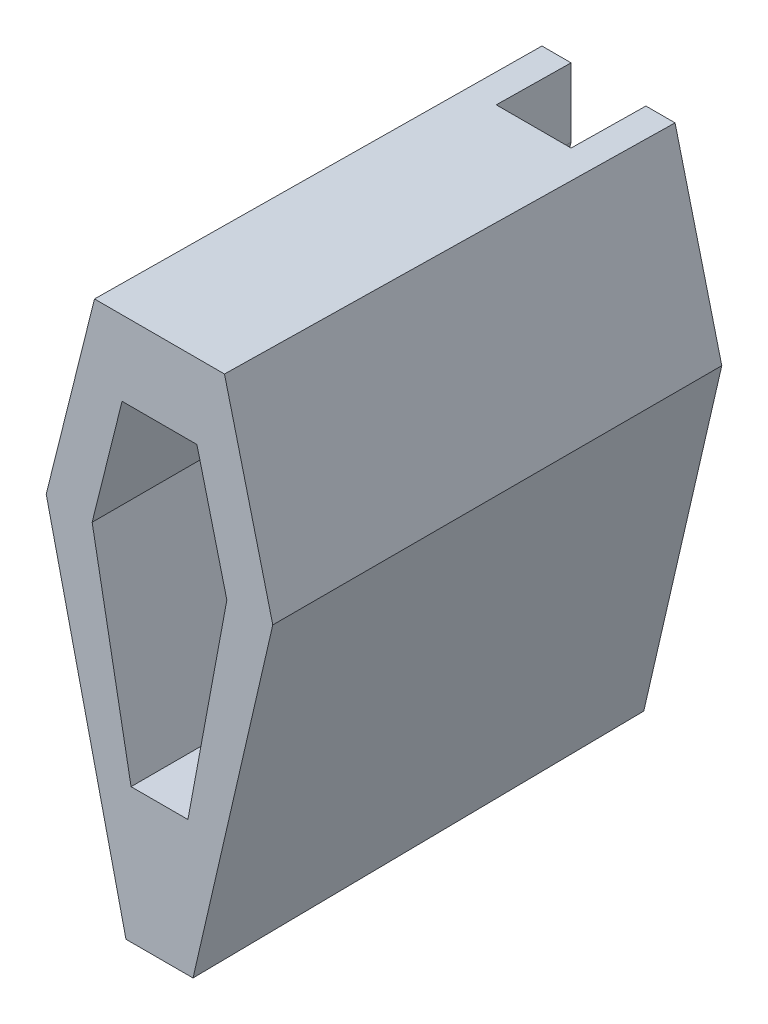
ISO-10303-21;
HEADER;
FILE_DESCRIPTION(('STEP AP214'),'2;1');
FILE_NAME('part.step','',(''),(''),'','','');
FILE_SCHEMA(('AUTOMOTIVE_DESIGN { 1 0 10303 214 1 1 1 1 }'));
ENDSEC;
DATA;
#1=APPLICATION_CONTEXT('core data for automotive mechanical design processes');
#2=APPLICATION_PROTOCOL_DEFINITION('international standard','automotive_design',2000,#1);
#3=PRODUCT_CONTEXT('',#1,'mechanical');
#4=PRODUCT('Part','Part','',(#3));
#5=PRODUCT_RELATED_PRODUCT_CATEGORY('part','',(#4));
#6=PRODUCT_DEFINITION_FORMATION('','',#4);
#7=PRODUCT_DEFINITION_CONTEXT('part definition',#1,'design');
#8=PRODUCT_DEFINITION('design','',#6,#7);
#9=PRODUCT_DEFINITION_SHAPE('','',#8);
#10=(LENGTH_UNIT() NAMED_UNIT(*) SI_UNIT(.MILLI.,.METRE.));
#11=(NAMED_UNIT(*) PLANE_ANGLE_UNIT() SI_UNIT($,.RADIAN.));
#12=(NAMED_UNIT(*) SI_UNIT($,.STERADIAN.) SOLID_ANGLE_UNIT());
#13=UNCERTAINTY_MEASURE_WITH_UNIT(LENGTH_MEASURE(1.E-05),#10,'distance_accuracy_value','');
#14=(GEOMETRIC_REPRESENTATION_CONTEXT(3) GLOBAL_UNCERTAINTY_ASSIGNED_CONTEXT((#13)) GLOBAL_UNIT_ASSIGNED_CONTEXT((#10,
#11,#12)) REPRESENTATION_CONTEXT('',''));
#15=CARTESIAN_POINT('',(0.,0.,0.));
#16=DIRECTION('',(0.,0.,1.));
#17=DIRECTION('',(1.,0.,0.));
#18=AXIS2_PLACEMENT_3D('',#15,#16,#17);
#19=CARTESIAN_POINT('',(2.5,6.80601654550013,30.0001));
#20=DIRECTION('',(0.,-1.,0.));
#21=DIRECTION('',(0.,0.,-1.));
#22=AXIS2_PLACEMENT_3D('',#19,#20,#21);
#23=PLANE('',#22);
#24=DIRECTION('',(0.,0.,-1.));
#25=VECTOR('',#24,1.);
#26=CARTESIAN_POINT('',(-2.5,6.80601654550013,30.0001));
#27=LINE('',#26,#25);
#28=CARTESIAN_POINT('',(-2.5,6.80601654550013,30.));
#29=VERTEX_POINT('',#28);
#30=CARTESIAN_POINT('',(-2.5,6.80601654550013,5.));
#31=VERTEX_POINT('',#30);
#32=EDGE_CURVE('E182',#29,#31,#27,.T.);
#33=ORIENTED_EDGE('',*,*,#32,.T.);
#34=DIRECTION('',(-1.,0.,0.));
#35=VECTOR('',#34,1.);
#36=CARTESIAN_POINT('',(2.5,6.80601654550013,5.));
#37=LINE('',#36,#35);
#38=CARTESIAN_POINT('',(2.5,6.80601654550013,5.));
#39=VERTEX_POINT('',#38);
#40=EDGE_CURVE('E168',#39,#31,#37,.T.);
#41=ORIENTED_EDGE('',*,*,#40,.F.);
#42=DIRECTION('',(0.,0.,-1.));
#43=VECTOR('',#42,1.);
#44=CARTESIAN_POINT('',(2.5,6.80601654550013,30.0001));
#45=LINE('',#44,#43);
#46=CARTESIAN_POINT('',(2.5,6.80601654550013,30.));
#47=VERTEX_POINT('',#46);
#48=EDGE_CURVE('E483',#47,#39,#45,.T.);
#49=ORIENTED_EDGE('',*,*,#48,.F.);
#50=DIRECTION('',(-1.,0.,0.));
#51=VECTOR('',#50,1.);
#52=CARTESIAN_POINT('',(0.,6.80601654550013,30.));
#53=LINE('',#52,#51);
#54=EDGE_CURVE('E189',#47,#29,#53,.T.);
#55=ORIENTED_EDGE('',*,*,#54,.T.);
#56=EDGE_LOOP('',(#33,#41,#49,#55));
#57=FACE_BOUND('',#56,.T.);
#58=ADVANCED_FACE('F47',(#57),#23,.T.);
#59=CARTESIAN_POINT('',(0.,0.,30.));
#60=DIRECTION('',(0.,0.,-1.));
#61=DIRECTION('',(-1.,0.,0.));
#62=AXIS2_PLACEMENT_3D('',#59,#60,#61);
#63=PLANE('',#62);
#64=DIRECTION('',(-0.242535625036333,0.970142500145332,0.));
#65=VECTOR('',#64,1.);
#66=CARTESIAN_POINT('',(4.34232921921325,11.8060165455001,30.));
#67=LINE('',#66,#65);
#68=CARTESIAN_POINT('',(7.56878565192639,-1.09980918535245,30.));
#69=VERTEX_POINT('',#68);
#70=CARTESIAN_POINT('',(4.34232921921325,11.8060165455001,30.));
#71=VERTEX_POINT('',#70);
#72=EDGE_CURVE('E297',#69,#71,#67,.T.);
#73=ORIENTED_EDGE('',*,*,#72,.T.);
#74=DIRECTION('',(-1.,0.,0.));
#75=VECTOR('',#74,1.);
#76=CARTESIAN_POINT('',(-4.34232921921325,11.8060165455001,30.));
#77=LINE('',#76,#75);
#78=CARTESIAN_POINT('',(-4.34232921921325,11.8060165455001,30.));
#79=VERTEX_POINT('',#78);
#80=EDGE_CURVE('E12',#71,#79,#77,.T.);
#81=ORIENTED_EDGE('',*,*,#80,.T.);
#82=DIRECTION('',(-0.242535625036333,-0.970142500145332,0.));
#83=VECTOR('',#82,1.);
#84=CARTESIAN_POINT('',(-4.34232921921325,11.8060165455001,30.));
#85=LINE('',#84,#83);
#86=CARTESIAN_POINT('',(-7.56878565192639,-1.09980918535245,30.));
#87=VERTEX_POINT('',#86);
#88=EDGE_CURVE('E58',#79,#87,#85,.T.);
#89=ORIENTED_EDGE('',*,*,#88,.T.);
#90=DIRECTION('',(0.224823451265255,-0.974399515476675,0.));
#91=VECTOR('',#90,1.);
#92=CARTESIAN_POINT('',(-7.56878565192639,-1.09980918535245,30.));
#93=LINE('',#92,#91);
#94=CARTESIAN_POINT('',(-2.24026087246672,-24.1939834544998,30.));
#95=VERTEX_POINT('',#94);
#96=EDGE_CURVE('E458',#87,#95,#93,.T.);
#97=ORIENTED_EDGE('',*,*,#96,.T.);
#98=DIRECTION('',(1.,0.,0.));
#99=VECTOR('',#98,1.);
#100=CARTESIAN_POINT('',(2.24026087246701,-24.1939834544998,30.));
#101=LINE('',#100,#99);
#102=CARTESIAN_POINT('',(2.24026087246701,-24.1939834544998,30.));
#103=VERTEX_POINT('',#102);
#104=EDGE_CURVE('E255',#95,#103,#101,.T.);
#105=ORIENTED_EDGE('',*,*,#104,.T.);
#106=DIRECTION('',(0.224823451265243,0.974399515476678,0.));
#107=VECTOR('',#106,1.);
#108=CARTESIAN_POINT('',(7.56878565192639,-1.09980918535245,30.));
#109=LINE('',#108,#107);
#110=EDGE_CURVE('E269',#103,#69,#109,.T.);
#111=ORIENTED_EDGE('',*,*,#110,.T.);
#112=EDGE_LOOP('',(#73,#81,#89,#97,#105,#111));
#113=FACE_BOUND('',#112,.T.);
#114=ORIENTED_EDGE('',*,*,#54,.F.);
#115=DIRECTION('',(0.242535625036333,-0.970142500145332,0.));
#116=VECTOR('',#115,1.);
#117=CARTESIAN_POINT('',(3.95435683423532,0.988589208558831,30.));
#118=LINE('',#117,#116);
#119=CARTESIAN_POINT('',(4.5,-1.19398345449987,30.));
#120=VERTEX_POINT('',#119);
#121=EDGE_CURVE('E190',#47,#120,#118,.T.);
#122=ORIENTED_EDGE('',*,*,#121,.T.);
#123=DIRECTION('',(-0.182592193842777,-0.983188736076488,0.));
#124=VECTOR('',#123,1.);
#125=CARTESIAN_POINT('',(4.56431740848193,-0.847658947289501,30.));
#126=LINE('',#125,#124);
#127=CARTESIAN_POINT('',(1.9,-15.1939834544999,30.));
#128=VERTEX_POINT('',#127);
#129=EDGE_CURVE('E194',#120,#128,#126,.T.);
#130=ORIENTED_EDGE('',*,*,#129,.T.);
#131=DIRECTION('',(1.,0.,0.));
#132=VECTOR('',#131,1.);
#133=CARTESIAN_POINT('',(0.,-15.1939834544999,30.));
#134=LINE('',#133,#132);
#135=CARTESIAN_POINT('',(-1.9,-15.1939834544999,30.));
#136=VERTEX_POINT('',#135);
#137=EDGE_CURVE('E202',#136,#128,#134,.T.);
#138=ORIENTED_EDGE('',*,*,#137,.F.);
#139=DIRECTION('',(0.182592193842777,-0.983188736076488,0.));
#140=VECTOR('',#139,1.);
#141=CARTESIAN_POINT('',(-4.56431740848193,-0.847658947289501,30.));
#142=LINE('',#141,#140);
#143=CARTESIAN_POINT('',(-4.5,-1.19398345449987,30.));
#144=VERTEX_POINT('',#143);
#145=EDGE_CURVE('E204',#144,#136,#142,.T.);
#146=ORIENTED_EDGE('',*,*,#145,.F.);
#147=DIRECTION('',(-0.242535625036333,-0.970142500145332,0.));
#148=VECTOR('',#147,1.);
#149=CARTESIAN_POINT('',(-3.95435683423532,0.988589208558831,30.));
#150=LINE('',#149,#148);
#151=EDGE_CURVE('E206',#29,#144,#150,.T.);
#152=ORIENTED_EDGE('',*,*,#151,.F.);
#153=EDGE_LOOP('',(#114,#122,#130,#138,#146,#152));
#154=FACE_BOUND('',#153,.T.);
#155=ADVANCED_FACE('F49',(#113,#154),#63,.F.);
#156=CARTESIAN_POINT('',(0.,0.,0.));
#157=DIRECTION('',(0.,0.,-1.));
#158=DIRECTION('',(-1.,0.,0.));
#159=AXIS2_PLACEMENT_3D('',#156,#157,#158);
#160=PLANE('',#159);
#161=DIRECTION('',(0.,-1.,0.));
#162=VECTOR('',#161,1.);
#163=CARTESIAN_POINT('',(2.5,6.80601654550013,0.));
#164=LINE('',#163,#162);
#165=CARTESIAN_POINT('',(2.5,11.389549667597,0.));
#166=VERTEX_POINT('',#165);
#167=CARTESIAN_POINT('',(2.5,6.80601654550013,0.));
#168=VERTEX_POINT('',#167);
#169=EDGE_CURVE('E74',#166,#168,#164,.T.);
#170=ORIENTED_EDGE('',*,*,#169,.F.);
#171=DIRECTION('',(-1.,0.,0.));
#172=VECTOR('',#171,1.);
#173=CARTESIAN_POINT('',(-4.44644593868902,11.389549667597,0.));
#174=LINE('',#173,#172);
#175=CARTESIAN_POINT('',(4.44644593868902,11.389549667597,0.));
#176=VERTEX_POINT('',#175);
#177=EDGE_CURVE('E52',#176,#166,#174,.T.);
#178=ORIENTED_EDGE('',*,*,#177,.F.);
#179=DIRECTION('',(-0.242535625036327,0.970142500145333,0.));
#180=VECTOR('',#179,1.);
#181=CARTESIAN_POINT('',(7.56878565192631,-1.09980918535247,0.));
#182=LINE('',#181,#180);
#183=CARTESIAN_POINT('',(7.56878565192631,-1.09980918535247,0.));
#184=VERTEX_POINT('',#183);
#185=EDGE_CURVE('E305',#184,#176,#182,.T.);
#186=ORIENTED_EDGE('',*,*,#185,.F.);
#187=DIRECTION('',(0.22482345126524,0.974399515476679,0.));
#188=VECTOR('',#187,1.);
#189=CARTESIAN_POINT('',(7.56878565192631,-1.09980918535247,0.));
#190=LINE('',#189,#188);
#191=CARTESIAN_POINT('',(2.35562600129471,-23.6939834544998,0.));
#192=VERTEX_POINT('',#191);
#193=EDGE_CURVE('E402',#192,#184,#190,.T.);
#194=ORIENTED_EDGE('',*,*,#193,.F.);
#195=DIRECTION('',(1.,0.,0.));
#196=VECTOR('',#195,1.);
#197=CARTESIAN_POINT('',(-2.35562600129444,-23.6939834544999,0.));
#198=LINE('',#197,#196);
#199=CARTESIAN_POINT('',(-2.35562600129444,-23.6939834544999,0.));
#200=VERTEX_POINT('',#199);
#201=EDGE_CURVE('E341',#200,#192,#198,.T.);
#202=ORIENTED_EDGE('',*,*,#201,.F.);
#203=DIRECTION('',(0.224823451265253,-0.974399515476676,0.));
#204=VECTOR('',#203,1.);
#205=CARTESIAN_POINT('',(-2.35562600129444,-23.6939834544999,0.));
#206=LINE('',#205,#204);
#207=CARTESIAN_POINT('',(-7.56878565192634,-1.09980918535246,0.));
#208=VERTEX_POINT('',#207);
#209=EDGE_CURVE('E215',#208,#200,#206,.T.);
#210=ORIENTED_EDGE('',*,*,#209,.F.);
#211=DIRECTION('',(-0.242535625036329,-0.970142500145333,0.));
#212=VECTOR('',#211,1.);
#213=CARTESIAN_POINT('',(-7.56878565192634,-1.09980918535246,0.));
#214=LINE('',#213,#212);
#215=CARTESIAN_POINT('',(-4.44644593868902,11.389549667597,0.));
#216=VERTEX_POINT('',#215);
#217=EDGE_CURVE('E209',#216,#208,#214,.T.);
#218=ORIENTED_EDGE('',*,*,#217,.F.);
#219=CARTESIAN_POINT('',(-2.5,11.389549667597,0.));
#220=VERTEX_POINT('',#219);
#221=EDGE_CURVE('E396',#220,#216,#174,.T.);
#222=ORIENTED_EDGE('',*,*,#221,.F.);
#223=DIRECTION('',(0.,1.,0.));
#224=VECTOR('',#223,1.);
#225=CARTESIAN_POINT('',(-2.5,6.80601654550013,0.));
#226=LINE('',#225,#224);
#227=CARTESIAN_POINT('',(-2.5,6.80601654550013,0.));
#228=VERTEX_POINT('',#227);
#229=EDGE_CURVE('E466',#228,#220,#226,.T.);
#230=ORIENTED_EDGE('',*,*,#229,.F.);
#231=DIRECTION('',(-0.242535625036333,-0.970142500145332,0.));
#232=VECTOR('',#231,1.);
#233=CARTESIAN_POINT('',(-2.5,6.80601654550013,0.));
#234=LINE('',#233,#232);
#235=CARTESIAN_POINT('',(-4.5,-1.19398345449987,0.));
#236=VERTEX_POINT('',#235);
#237=EDGE_CURVE('E185',#228,#236,#234,.T.);
#238=ORIENTED_EDGE('',*,*,#237,.T.);
#239=DIRECTION('',(0.182592193842777,-0.983188736076488,0.));
#240=VECTOR('',#239,1.);
#241=CARTESIAN_POINT('',(-4.5,-1.19398345449987,0.));
#242=LINE('',#241,#240);
#243=CARTESIAN_POINT('',(-1.9,-15.1939834544999,0.));
#244=VERTEX_POINT('',#243);
#245=EDGE_CURVE('E472',#236,#244,#242,.T.);
#246=ORIENTED_EDGE('',*,*,#245,.T.);
#247=DIRECTION('',(1.,0.,0.));
#248=VECTOR('',#247,1.);
#249=CARTESIAN_POINT('',(-1.9,-15.1939834544999,0.));
#250=LINE('',#249,#248);
#251=CARTESIAN_POINT('',(1.9,-15.1939834544999,0.));
#252=VERTEX_POINT('',#251);
#253=EDGE_CURVE('E475',#244,#252,#250,.T.);
#254=ORIENTED_EDGE('',*,*,#253,.T.);
#255=DIRECTION('',(-0.182592193842777,-0.983188736076488,0.));
#256=VECTOR('',#255,1.);
#257=CARTESIAN_POINT('',(4.5,-1.19398345449987,0.));
#258=LINE('',#257,#256);
#259=CARTESIAN_POINT('',(4.5,-1.19398345449987,0.));
#260=VERTEX_POINT('',#259);
#261=EDGE_CURVE('E478',#260,#252,#258,.T.);
#262=ORIENTED_EDGE('',*,*,#261,.F.);
#263=DIRECTION('',(0.242535625036333,-0.970142500145332,0.));
#264=VECTOR('',#263,1.);
#265=CARTESIAN_POINT('',(2.5,6.80601654550013,0.));
#266=LINE('',#265,#264);
#267=EDGE_CURVE('E481',#168,#260,#266,.T.);
#268=ORIENTED_EDGE('',*,*,#267,.F.);
#269=EDGE_LOOP('',(#170,#178,#186,#194,#202,#210,#218,#222,#230,#238,#246,#254,#262,#268));
#270=FACE_BOUND('',#269,.T.);
#271=ADVANCED_FACE('F351',(#270),#160,.T.);
#272=CARTESIAN_POINT('',(0.,11.3873551387695,-0.158081874740573));
#273=DIRECTION('',(0.,-0.99990365578044,0.0138808917908926));
#274=DIRECTION('',(0.,-0.0138808917908926,-0.99990365578044));
#275=AXIS2_PLACEMENT_3D('',#272,#273,#274);
#276=PLANE('',#275);
#277=ORIENTED_EDGE('',*,*,#177,.T.);
#278=DIRECTION('',(0.,0.0138808917908926,0.99990365578044));
#279=VECTOR('',#278,1.);
#280=CARTESIAN_POINT('',(2.5,11.3873551387695,-0.158081874740573));
#281=LINE('',#280,#279);
#282=CARTESIAN_POINT('',(2.5,11.4589608139142,5.));
#283=VERTEX_POINT('',#282);
#284=EDGE_CURVE('E409',#166,#283,#281,.T.);
#285=ORIENTED_EDGE('',*,*,#284,.T.);
#286=DIRECTION('',(1.,0.,0.));
#287=VECTOR('',#286,1.);
#288=CARTESIAN_POINT('',(0.,11.4589608139142,5.));
#289=LINE('',#288,#287);
#290=CARTESIAN_POINT('',(-2.5,11.4589608139142,5.));
#291=VERTEX_POINT('',#290);
#292=EDGE_CURVE('E460',#291,#283,#289,.T.);
#293=ORIENTED_EDGE('',*,*,#292,.F.);
#294=DIRECTION('',(0.,-0.0138808917908926,-0.99990365578044));
#295=VECTOR('',#294,1.);
#296=CARTESIAN_POINT('',(-2.5,11.3873551387695,-0.158081874740573));
#297=LINE('',#296,#295);
#298=EDGE_CURVE('E164',#291,#220,#297,.T.);
#299=ORIENTED_EDGE('',*,*,#298,.T.);
#300=ORIENTED_EDGE('',*,*,#221,.T.);
#301=DIRECTION('',(0.0034702020529234,0.0138808082116935,0.999897635191274));
#302=VECTOR('',#301,1.);
#303=CARTESIAN_POINT('',(-4.44644593868902,11.389549667597,0.));
#304=LINE('',#303,#302);
#305=EDGE_CURVE('E340',#216,#79,#304,.T.);
#306=ORIENTED_EDGE('',*,*,#305,.T.);
#307=ORIENTED_EDGE('',*,*,#80,.F.);
#308=DIRECTION('',(-0.00347020205292337,0.0138808082116935,0.999897635191274));
#309=VECTOR('',#308,1.);
#310=CARTESIAN_POINT('',(4.44644593868902,11.389549667597,0.));
#311=LINE('',#310,#309);
#312=EDGE_CURVE('E310',#176,#71,#311,.T.);
#313=ORIENTED_EDGE('',*,*,#312,.F.);
#314=EDGE_LOOP('',(#277,#285,#293,#299,#300,#306,#307,#313));
#315=FACE_BOUND('',#314,.T.);
#316=ADVANCED_FACE('F321',(#315),#276,.F.);
#317=CARTESIAN_POINT('',(6.86478433467132,1.71619608366783,0.));
#318=DIRECTION('',(-0.970142500145332,-0.242535625036333,0.));
#319=DIRECTION('',(0.242535625036333,-0.970142500145332,0.));
#320=AXIS2_PLACEMENT_3D('',#317,#318,#319);
#321=PLANE('',#320);
#322=ORIENTED_EDGE('',*,*,#312,.T.);
#323=ORIENTED_EDGE('',*,*,#72,.F.);
#324=DIRECTION('',(0.,0.,1.));
#325=VECTOR('',#324,1.);
#326=CARTESIAN_POINT('',(7.56878565192631,-1.09980918535247,0.));
#327=LINE('',#326,#325);
#328=EDGE_CURVE('E290',#184,#69,#327,.T.);
#329=ORIENTED_EDGE('',*,*,#328,.F.);
#330=ORIENTED_EDGE('',*,*,#185,.T.);
#331=EDGE_LOOP('',(#322,#323,#329,#330));
#332=FACE_BOUND('',#331,.T.);
#333=ADVANCED_FACE('F312',(#332),#321,.F.);
#334=CARTESIAN_POINT('',(-6.86478433467127,1.71619608366782,0.));
#335=DIRECTION('',(0.970142500145332,-0.242535625036333,0.));
#336=DIRECTION('',(0.242535625036333,0.970142500145332,0.));
#337=AXIS2_PLACEMENT_3D('',#334,#335,#336);
#338=PLANE('',#337);
#339=DIRECTION('',(0.,0.,1.));
#340=VECTOR('',#339,1.);
#341=CARTESIAN_POINT('',(-7.56878565192634,-1.09980918535246,0.));
#342=LINE('',#341,#340);
#343=EDGE_CURVE('E221',#208,#87,#342,.T.);
#344=ORIENTED_EDGE('',*,*,#343,.T.);
#345=ORIENTED_EDGE('',*,*,#88,.F.);
#346=ORIENTED_EDGE('',*,*,#305,.F.);
#347=ORIENTED_EDGE('',*,*,#217,.T.);
#348=EDGE_LOOP('',(#344,#345,#346,#347));
#349=FACE_BOUND('',#348,.T.);
#350=ADVANCED_FACE('F234',(#349),#338,.F.);
#351=CARTESIAN_POINT('',(-7.42714980599322,-1.71366818838226,0.));
#352=DIRECTION('',(0.974399515476675,0.224823451265255,0.));
#353=DIRECTION('',(-0.224823451265255,0.974399515476675,0.));
#354=AXIS2_PLACEMENT_3D('',#351,#352,#353);
#355=PLANE('',#354);
#356=DIRECTION('',(0.00384494188636854,-0.0166642291541602,0.999853749249653));
#357=VECTOR('',#356,1.);
#358=CARTESIAN_POINT('',(-2.35562600129444,-23.6939834544999,0.));
#359=LINE('',#358,#357);
#360=EDGE_CURVE('E568',#200,#95,#359,.T.);
#361=ORIENTED_EDGE('',*,*,#360,.T.);
#362=ORIENTED_EDGE('',*,*,#96,.F.);
#363=ORIENTED_EDGE('',*,*,#343,.F.);
#364=ORIENTED_EDGE('',*,*,#209,.T.);
#365=EDGE_LOOP('',(#361,#362,#363,#364));
#366=FACE_BOUND('',#365,.T.);
#367=ADVANCED_FACE('F223',(#366),#355,.F.);
#368=CARTESIAN_POINT('',(0.,-23.6874036201609,-0.394790060336016));
#369=DIRECTION('',(0.,0.9998611400396,0.0166643523339934));
#370=DIRECTION('',(0.,-0.0166643523339934,0.9998611400396));
#371=AXIS2_PLACEMENT_3D('',#368,#369,#370);
#372=PLANE('',#371);
#373=DIRECTION('',(-0.0038449418863684,-0.0166642291541609,0.999853749249653));
#374=VECTOR('',#373,1.);
#375=CARTESIAN_POINT('',(2.35562600129471,-23.6939834544998,0.));
#376=LINE('',#375,#374);
#377=EDGE_CURVE('E298',#192,#103,#376,.T.);
#378=ORIENTED_EDGE('',*,*,#377,.T.);
#379=ORIENTED_EDGE('',*,*,#104,.F.);
#380=ORIENTED_EDGE('',*,*,#360,.F.);
#381=ORIENTED_EDGE('',*,*,#201,.T.);
#382=EDGE_LOOP('',(#378,#379,#380,#381));
#383=FACE_BOUND('',#382,.T.);
#384=ADVANCED_FACE('F233',(#383),#372,.F.);
#385=CARTESIAN_POINT('',(7.42714980599318,-1.71366818838216,0.));
#386=DIRECTION('',(-0.974399515476678,0.224823451265243,0.));
#387=DIRECTION('',(-0.224823451265243,-0.974399515476678,0.));
#388=AXIS2_PLACEMENT_3D('',#385,#386,#387);
#389=PLANE('',#388);
#390=ORIENTED_EDGE('',*,*,#328,.T.);
#391=ORIENTED_EDGE('',*,*,#110,.F.);
#392=ORIENTED_EDGE('',*,*,#377,.F.);
#393=ORIENTED_EDGE('',*,*,#193,.T.);
#394=EDGE_LOOP('',(#390,#391,#392,#393));
#395=FACE_BOUND('',#394,.T.);
#396=ADVANCED_FACE('F275',(#395),#389,.F.);
#397=CARTESIAN_POINT('',(-2.5,6.80601654550013,30.0001));
#398=DIRECTION('',(0.970142500145332,-0.242535625036333,0.));
#399=DIRECTION('',(0.242535625036333,0.970142500145332,0.));
#400=AXIS2_PLACEMENT_3D('',#397,#398,#399);
#401=PLANE('',#400);
#402=ORIENTED_EDGE('',*,*,#151,.T.);
#403=DIRECTION('',(0.,0.,-1.));
#404=VECTOR('',#403,1.);
#405=CARTESIAN_POINT('',(-4.5,-1.19398345449987,30.0001));
#406=LINE('',#405,#404);
#407=EDGE_CURVE('E191',#144,#236,#406,.T.);
#408=ORIENTED_EDGE('',*,*,#407,.T.);
#409=ORIENTED_EDGE('',*,*,#237,.F.);
#410=DIRECTION('',(0.,0.,-1.));
#411=VECTOR('',#410,1.);
#412=CARTESIAN_POINT('',(-2.5,6.80601654550013,5.));
#413=LINE('',#412,#411);
#414=EDGE_CURVE('E161',#31,#228,#413,.T.);
#415=ORIENTED_EDGE('',*,*,#414,.F.);
#416=ORIENTED_EDGE('',*,*,#32,.F.);
#417=EDGE_LOOP('',(#402,#408,#409,#415,#416));
#418=FACE_BOUND('',#417,.T.);
#419=ADVANCED_FACE('F181',(#418),#401,.T.);
#420=CARTESIAN_POINT('',(-4.5,-1.19398345449987,30.0001));
#421=DIRECTION('',(0.983188736076488,0.182592193842777,0.));
#422=DIRECTION('',(-0.182592193842777,0.983188736076488,0.));
#423=AXIS2_PLACEMENT_3D('',#420,#421,#422);
#424=PLANE('',#423);
#425=ORIENTED_EDGE('',*,*,#145,.T.);
#426=DIRECTION('',(0.,0.,-1.));
#427=VECTOR('',#426,1.);
#428=CARTESIAN_POINT('',(-1.9,-15.1939834544999,30.0001));
#429=LINE('',#428,#427);
#430=EDGE_CURVE('E196',#136,#244,#429,.T.);
#431=ORIENTED_EDGE('',*,*,#430,.T.);
#432=ORIENTED_EDGE('',*,*,#245,.F.);
#433=ORIENTED_EDGE('',*,*,#407,.F.);
#434=EDGE_LOOP('',(#425,#431,#432,#433));
#435=FACE_BOUND('',#434,.T.);
#436=ADVANCED_FACE('F491',(#435),#424,.T.);
#437=CARTESIAN_POINT('',(-1.9,-15.1939834544999,30.0001));
#438=DIRECTION('',(0.,1.,0.));
#439=DIRECTION('',(0.,0.,1.));
#440=AXIS2_PLACEMENT_3D('',#437,#438,#439);
#441=PLANE('',#440);
#442=ORIENTED_EDGE('',*,*,#137,.T.);
#443=DIRECTION('',(0.,0.,-1.));
#444=VECTOR('',#443,1.);
#445=CARTESIAN_POINT('',(1.9,-15.1939834544999,30.0001));
#446=LINE('',#445,#444);
#447=EDGE_CURVE('E486',#128,#252,#446,.T.);
#448=ORIENTED_EDGE('',*,*,#447,.T.);
#449=ORIENTED_EDGE('',*,*,#253,.F.);
#450=ORIENTED_EDGE('',*,*,#430,.F.);
#451=EDGE_LOOP('',(#442,#448,#449,#450));
#452=FACE_BOUND('',#451,.T.);
#453=ADVANCED_FACE('F496',(#452),#441,.T.);
#454=CARTESIAN_POINT('',(4.5,-1.19398345449987,30.0001));
#455=DIRECTION('',(0.983188736076488,-0.182592193842777,0.));
#456=DIRECTION('',(0.182592193842777,0.983188736076488,0.));
#457=AXIS2_PLACEMENT_3D('',#454,#455,#456);
#458=PLANE('',#457);
#459=DIRECTION('',(0.,0.,-1.));
#460=VECTOR('',#459,1.);
#461=CARTESIAN_POINT('',(4.5,-1.19398345449987,30.0001));
#462=LINE('',#461,#460);
#463=EDGE_CURVE('E66',#120,#260,#462,.T.);
#464=ORIENTED_EDGE('',*,*,#463,.T.);
#465=ORIENTED_EDGE('',*,*,#261,.T.);
#466=ORIENTED_EDGE('',*,*,#447,.F.);
#467=ORIENTED_EDGE('',*,*,#129,.F.);
#468=EDGE_LOOP('',(#464,#465,#466,#467));
#469=FACE_BOUND('',#468,.T.);
#470=ADVANCED_FACE('F507',(#469),#458,.F.);
#471=CARTESIAN_POINT('',(2.5,6.80601654550013,30.0001));
#472=DIRECTION('',(0.970142500145332,0.242535625036333,0.));
#473=DIRECTION('',(-0.242535625036333,0.970142500145332,0.));
#474=AXIS2_PLACEMENT_3D('',#471,#472,#473);
#475=PLANE('',#474);
#476=ORIENTED_EDGE('',*,*,#48,.T.);
#477=DIRECTION('',(0.,0.,-1.));
#478=VECTOR('',#477,1.);
#479=CARTESIAN_POINT('',(2.5,6.80601654550013,5.));
#480=LINE('',#479,#478);
#481=EDGE_CURVE('E186',#39,#168,#480,.T.);
#482=ORIENTED_EDGE('',*,*,#481,.T.);
#483=ORIENTED_EDGE('',*,*,#267,.T.);
#484=ORIENTED_EDGE('',*,*,#463,.F.);
#485=ORIENTED_EDGE('',*,*,#121,.F.);
#486=EDGE_LOOP('',(#476,#482,#483,#484,#485));
#487=FACE_BOUND('',#486,.T.);
#488=ADVANCED_FACE('F505',(#487),#475,.F.);
#489=CARTESIAN_POINT('',(0.,0.,5.));
#490=DIRECTION('',(0.,0.,-1.));
#491=DIRECTION('',(-1.,0.,0.));
#492=AXIS2_PLACEMENT_3D('',#489,#490,#491);
#493=PLANE('',#492);
#494=ORIENTED_EDGE('',*,*,#292,.T.);
#495=DIRECTION('',(0.,-1.,0.));
#496=VECTOR('',#495,1.);
#497=CARTESIAN_POINT('',(2.5,6.80601654550013,5.));
#498=LINE('',#497,#496);
#499=EDGE_CURVE('E167',#283,#39,#498,.T.);
#500=ORIENTED_EDGE('',*,*,#499,.T.);
#501=ORIENTED_EDGE('',*,*,#40,.T.);
#502=DIRECTION('',(0.,1.,0.));
#503=VECTOR('',#502,1.);
#504=CARTESIAN_POINT('',(-2.5,6.80601654550013,5.));
#505=LINE('',#504,#503);
#506=EDGE_CURVE('E157',#31,#291,#505,.T.);
#507=ORIENTED_EDGE('',*,*,#506,.T.);
#508=EDGE_LOOP('',(#494,#500,#501,#507));
#509=FACE_BOUND('',#508,.T.);
#510=ADVANCED_FACE('F171',(#509),#493,.T.);
#511=CARTESIAN_POINT('',(-2.5,6.80601654550013,5.));
#512=DIRECTION('',(-1.,0.,0.));
#513=DIRECTION('',(0.,0.,1.));
#514=AXIS2_PLACEMENT_3D('',#511,#512,#513);
#515=PLANE('',#514);
#516=ORIENTED_EDGE('',*,*,#506,.F.);
#517=ORIENTED_EDGE('',*,*,#414,.T.);
#518=ORIENTED_EDGE('',*,*,#229,.T.);
#519=ORIENTED_EDGE('',*,*,#298,.F.);
#520=EDGE_LOOP('',(#516,#517,#518,#519));
#521=FACE_BOUND('',#520,.T.);
#522=ADVANCED_FACE('F159',(#521),#515,.F.);
#523=CARTESIAN_POINT('',(2.5,6.80601654550013,5.));
#524=DIRECTION('',(1.,0.,0.));
#525=DIRECTION('',(0.,0.,-1.));
#526=AXIS2_PLACEMENT_3D('',#523,#524,#525);
#527=PLANE('',#526);
#528=ORIENTED_EDGE('',*,*,#169,.T.);
#529=ORIENTED_EDGE('',*,*,#481,.F.);
#530=ORIENTED_EDGE('',*,*,#499,.F.);
#531=ORIENTED_EDGE('',*,*,#284,.F.);
#532=EDGE_LOOP('',(#528,#529,#530,#531));
#533=FACE_BOUND('',#532,.T.);
#534=ADVANCED_FACE('F637',(#533),#527,.F.);
#535=CLOSED_SHELL('',(#58,#155,#271,#316,#333,#350,#367,#384,#396,#419,#436,#453,#470,#488,#510,
#522,#534));
#536=MANIFOLD_SOLID_BREP('B2',#535);
#537=ADVANCED_BREP_SHAPE_REPRESENTATION('',(#18,#536),#14);
#538=SHAPE_DEFINITION_REPRESENTATION(#9,#537);
ENDSEC;
END-ISO-10303-21;
